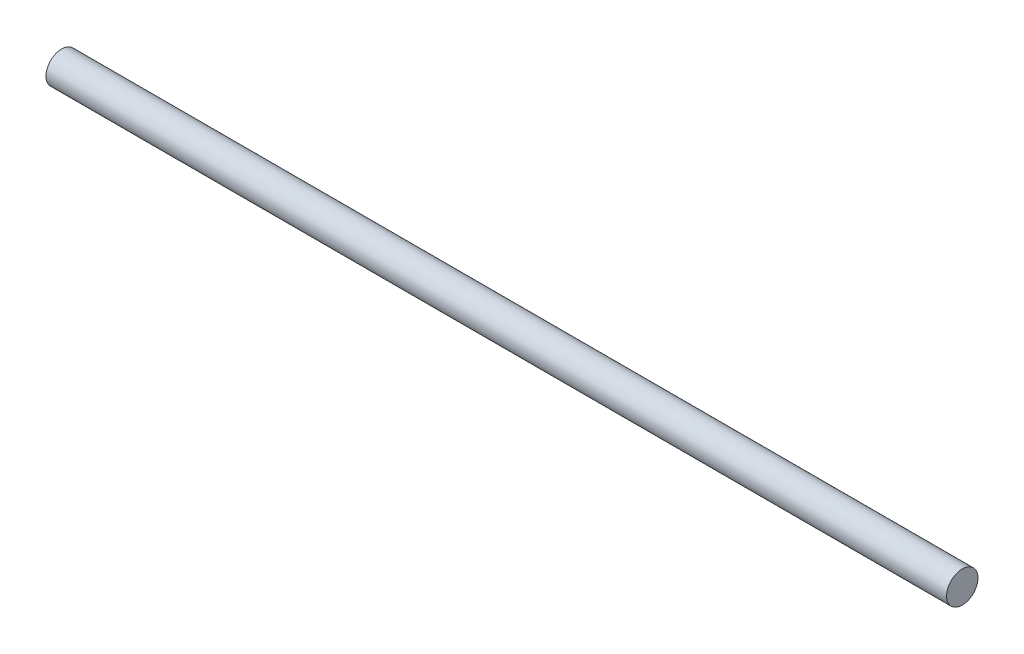
ISO-10303-21;
HEADER;
FILE_DESCRIPTION(('STEP AP214'),'2;1');
FILE_NAME('part.step','',(''),(''),'','','');
FILE_SCHEMA(('AUTOMOTIVE_DESIGN { 1 0 10303 214 1 1 1 1 }'));
ENDSEC;
DATA;
#1=APPLICATION_CONTEXT('core data for automotive mechanical design processes');
#2=APPLICATION_PROTOCOL_DEFINITION('international standard','automotive_design',2000,#1);
#3=PRODUCT_CONTEXT('',#1,'mechanical');
#4=PRODUCT('Part','Part','',(#3));
#5=PRODUCT_RELATED_PRODUCT_CATEGORY('part','',(#4));
#6=PRODUCT_DEFINITION_FORMATION('','',#4);
#7=PRODUCT_DEFINITION_CONTEXT('part definition',#1,'design');
#8=PRODUCT_DEFINITION('design','',#6,#7);
#9=PRODUCT_DEFINITION_SHAPE('','',#8);
#10=(LENGTH_UNIT() NAMED_UNIT(*) SI_UNIT(.MILLI.,.METRE.));
#11=(NAMED_UNIT(*) PLANE_ANGLE_UNIT() SI_UNIT($,.RADIAN.));
#12=(NAMED_UNIT(*) SI_UNIT($,.STERADIAN.) SOLID_ANGLE_UNIT());
#13=UNCERTAINTY_MEASURE_WITH_UNIT(LENGTH_MEASURE(1.E-05),#10,'distance_accuracy_value','');
#14=(GEOMETRIC_REPRESENTATION_CONTEXT(3) GLOBAL_UNCERTAINTY_ASSIGNED_CONTEXT((#13)) GLOBAL_UNIT_ASSIGNED_CONTEXT((#10,
#11,#12)) REPRESENTATION_CONTEXT('',''));
#15=CARTESIAN_POINT('',(0.,0.,0.));
#16=DIRECTION('',(0.,0.,1.));
#17=DIRECTION('',(1.,0.,0.));
#18=AXIS2_PLACEMENT_3D('',#15,#16,#17);
#19=CARTESIAN_POINT('',(-273.05,0.,0.));
#20=DIRECTION('',(1.,0.,0.));
#21=DIRECTION('',(0.,0.,-1.));
#22=AXIS2_PLACEMENT_3D('',#19,#20,#21);
#23=PLANE('',#22);
#24=CARTESIAN_POINT('',(-273.05,0.,0.));
#25=DIRECTION('',(1.,0.,0.));
#26=DIRECTION('',(0.,0.,-1.));
#27=AXIS2_PLACEMENT_3D('',#24,#25,#26);
#28=CIRCLE('',#27,9.525);
#29=CARTESIAN_POINT('',(-273.05,0.,-9.525));
#30=VERTEX_POINT('',#29);
#31=EDGE_CURVE('E34',#30,#30,#28,.T.);
#32=ORIENTED_EDGE('',*,*,#31,.F.);
#33=EDGE_LOOP('',(#32));
#34=FACE_BOUND('',#33,.T.);
#35=ADVANCED_FACE('F31',(#34),#23,.F.);
#36=CARTESIAN_POINT('',(273.05,0.,0.));
#37=DIRECTION('',(1.,0.,0.));
#38=DIRECTION('',(0.,0.,-1.));
#39=AXIS2_PLACEMENT_3D('',#36,#37,#38);
#40=PLANE('',#39);
#41=CARTESIAN_POINT('',(273.05,0.,0.));
#42=DIRECTION('',(1.,0.,0.));
#43=DIRECTION('',(0.,0.,-1.));
#44=AXIS2_PLACEMENT_3D('',#41,#42,#43);
#45=CIRCLE('',#44,9.525);
#46=CARTESIAN_POINT('',(273.05,0.,-9.525));
#47=VERTEX_POINT('',#46);
#48=EDGE_CURVE('E10',#47,#47,#45,.F.);
#49=ORIENTED_EDGE('',*,*,#48,.F.);
#50=EDGE_LOOP('',(#49));
#51=FACE_BOUND('',#50,.T.);
#52=ADVANCED_FACE('F46',(#51),#40,.T.);
#53=CARTESIAN_POINT('',(-273.05,0.,0.));
#54=DIRECTION('',(1.,0.,0.));
#55=DIRECTION('',(0.,0.,-1.));
#56=AXIS2_PLACEMENT_3D('',#53,#54,#55);
#57=CYLINDRICAL_SURFACE('',#56,9.525);
#58=ORIENTED_EDGE('',*,*,#48,.T.);
#59=EDGE_LOOP('',(#58));
#60=FACE_BOUND('',#59,.T.);
#61=ORIENTED_EDGE('',*,*,#31,.T.);
#62=EDGE_LOOP('',(#61));
#63=FACE_BOUND('',#62,.T.);
#64=ADVANCED_FACE('F43',(#60,#63),#57,.T.);
#65=CLOSED_SHELL('',(#35,#52,#64));
#66=MANIFOLD_SOLID_BREP('B2',#65);
#67=ADVANCED_BREP_SHAPE_REPRESENTATION('',(#18,#66),#14);
#68=SHAPE_DEFINITION_REPRESENTATION(#9,#67);
ENDSEC;
END-ISO-10303-21;
